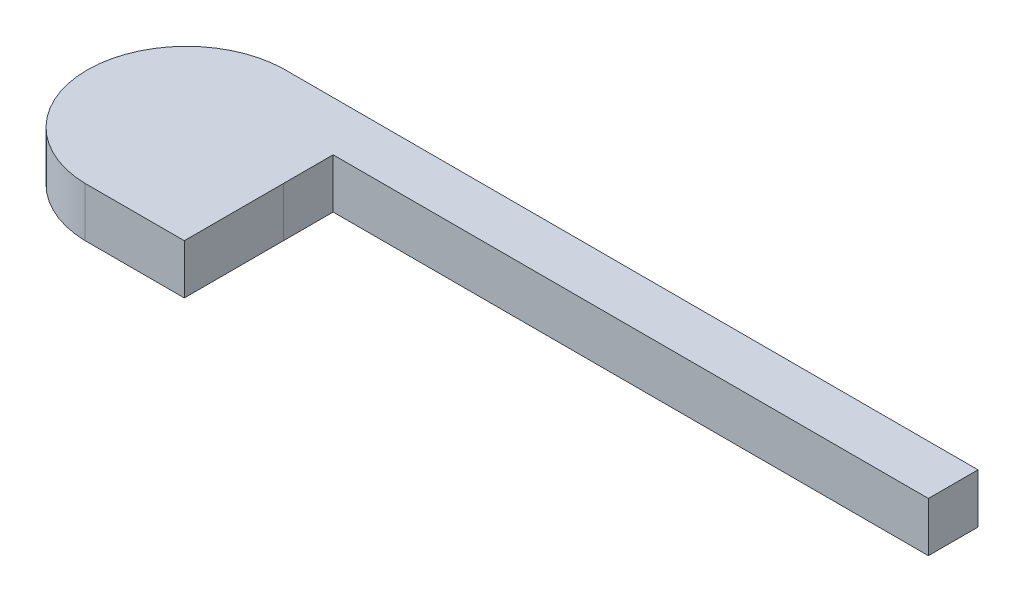
ISO-10303-21;
HEADER;
FILE_DESCRIPTION(('STEP AP214'),'2;1');
FILE_NAME('part.step','',(''),(''),'','','');
FILE_SCHEMA(('AUTOMOTIVE_DESIGN { 1 0 10303 214 1 1 1 1 }'));
ENDSEC;
DATA;
#1=APPLICATION_CONTEXT('core data for automotive mechanical design processes');
#2=APPLICATION_PROTOCOL_DEFINITION('international standard','automotive_design',2000,#1);
#3=PRODUCT_CONTEXT('',#1,'mechanical');
#4=PRODUCT('Part','Part','',(#3));
#5=PRODUCT_RELATED_PRODUCT_CATEGORY('part','',(#4));
#6=PRODUCT_DEFINITION_FORMATION('','',#4);
#7=PRODUCT_DEFINITION_CONTEXT('part definition',#1,'design');
#8=PRODUCT_DEFINITION('design','',#6,#7);
#9=PRODUCT_DEFINITION_SHAPE('','',#8);
#10=(LENGTH_UNIT() NAMED_UNIT(*) SI_UNIT(.MILLI.,.METRE.));
#11=(NAMED_UNIT(*) PLANE_ANGLE_UNIT() SI_UNIT($,.RADIAN.));
#12=(NAMED_UNIT(*) SI_UNIT($,.STERADIAN.) SOLID_ANGLE_UNIT());
#13=UNCERTAINTY_MEASURE_WITH_UNIT(LENGTH_MEASURE(1.E-05),#10,'distance_accuracy_value','');
#14=(GEOMETRIC_REPRESENTATION_CONTEXT(3) GLOBAL_UNCERTAINTY_ASSIGNED_CONTEXT((#13)) GLOBAL_UNIT_ASSIGNED_CONTEXT((#10,
#11,#12)) REPRESENTATION_CONTEXT('',''));
#15=CARTESIAN_POINT('',(0.,0.,0.));
#16=DIRECTION('',(0.,0.,1.));
#17=DIRECTION('',(1.,0.,0.));
#18=AXIS2_PLACEMENT_3D('',#15,#16,#17);
#19=CARTESIAN_POINT('',(-50.8,6.35,-12.7));
#20=DIRECTION('',(0.,0.,1.));
#21=DIRECTION('',(1.,0.,0.));
#22=AXIS2_PLACEMENT_3D('',#19,#20,#21);
#23=PLANE('',#22);
#24=DIRECTION('',(0.,-1.,0.));
#25=VECTOR('',#24,1.);
#26=CARTESIAN_POINT('',(-38.1000000000014,137.49902365725,-12.7));
#27=LINE('',#26,#25);
#28=CARTESIAN_POINT('',(-38.1000000000014,6.34999999999999,-12.7));
#29=VERTEX_POINT('',#28);
#30=CARTESIAN_POINT('',(-38.1000000000014,0.,-12.7));
#31=VERTEX_POINT('',#30);
#32=EDGE_CURVE('E61',#29,#31,#27,.T.);
#33=ORIENTED_EDGE('',*,*,#32,.F.);
#34=DIRECTION('',(-1.,0.,0.));
#35=VECTOR('',#34,1.);
#36=CARTESIAN_POINT('',(-50.8,6.35,-12.7));
#37=LINE('',#36,#35);
#38=CARTESIAN_POINT('',(50.8000000000001,6.35,-12.7));
#39=VERTEX_POINT('',#38);
#40=EDGE_CURVE('E153',#39,#29,#37,.T.);
#41=ORIENTED_EDGE('',*,*,#40,.F.);
#42=DIRECTION('',(0.,-1.,0.));
#43=VECTOR('',#42,1.);
#44=CARTESIAN_POINT('',(50.8000000000001,6.35,-12.7));
#45=LINE('',#44,#43);
#46=CARTESIAN_POINT('',(50.8000000000001,0.,-12.7));
#47=VERTEX_POINT('',#46);
#48=EDGE_CURVE('E11',#39,#47,#45,.T.);
#49=ORIENTED_EDGE('',*,*,#48,.T.);
#50=DIRECTION('',(-1.,0.,0.));
#51=VECTOR('',#50,1.);
#52=CARTESIAN_POINT('',(-50.8,0.,-12.7));
#53=LINE('',#52,#51);
#54=EDGE_CURVE('E96',#47,#31,#53,.T.);
#55=ORIENTED_EDGE('',*,*,#54,.T.);
#56=EDGE_LOOP('',(#33,#41,#49,#55));
#57=FACE_BOUND('',#56,.T.);
#58=ADVANCED_FACE('F38',(#57),#23,.F.);
#59=CARTESIAN_POINT('',(-50.8,6.35,12.7));
#60=DIRECTION('',(0.,0.,-1.));
#61=DIRECTION('',(-1.,0.,0.));
#62=AXIS2_PLACEMENT_3D('',#59,#60,#61);
#63=PLANE('',#62);
#64=DIRECTION('',(1.,0.,0.));
#65=VECTOR('',#64,1.);
#66=CARTESIAN_POINT('',(-50.8,6.35,12.7));
#67=LINE('',#66,#65);
#68=CARTESIAN_POINT('',(-38.1,6.34999999999999,12.7));
#69=VERTEX_POINT('',#68);
#70=CARTESIAN_POINT('',(-25.4,6.34999999999999,12.7));
#71=VERTEX_POINT('',#70);
#72=EDGE_CURVE('E46',#69,#71,#67,.T.);
#73=ORIENTED_EDGE('',*,*,#72,.F.);
#74=DIRECTION('',(0.,-1.,0.));
#75=VECTOR('',#74,1.);
#76=CARTESIAN_POINT('',(-38.1,137.49902365725,12.7));
#77=LINE('',#76,#75);
#78=CARTESIAN_POINT('',(-38.1,0.,12.7));
#79=VERTEX_POINT('',#78);
#80=EDGE_CURVE('E113',#69,#79,#77,.T.);
#81=ORIENTED_EDGE('',*,*,#80,.T.);
#82=DIRECTION('',(1.,0.,0.));
#83=VECTOR('',#82,1.);
#84=CARTESIAN_POINT('',(-50.8,0.,12.7));
#85=LINE('',#84,#83);
#86=CARTESIAN_POINT('',(-25.4,0.,12.7));
#87=VERTEX_POINT('',#86);
#88=EDGE_CURVE('E101',#79,#87,#85,.T.);
#89=ORIENTED_EDGE('',*,*,#88,.T.);
#90=DIRECTION('',(0.,-1.,0.));
#91=VECTOR('',#90,1.);
#92=CARTESIAN_POINT('',(-25.4,145.43652365725,12.7));
#93=LINE('',#92,#91);
#94=EDGE_CURVE('E133',#71,#87,#93,.T.);
#95=ORIENTED_EDGE('',*,*,#94,.F.);
#96=EDGE_LOOP('',(#73,#81,#89,#95));
#97=FACE_BOUND('',#96,.T.);
#98=ADVANCED_FACE('F158',(#97),#63,.F.);
#99=CARTESIAN_POINT('',(0.,6.35,0.));
#100=DIRECTION('',(0.,1.,0.));
#101=DIRECTION('',(0.,0.,1.));
#102=AXIS2_PLACEMENT_3D('',#99,#100,#101);
#103=PLANE('',#102);
#104=CARTESIAN_POINT('',(-37.843404017437,6.34999999999999,0.));
#105=DIRECTION('',(0.,1.,0.));
#106=DIRECTION('',(0.,0.,1.));
#107=AXIS2_PLACEMENT_3D('',#104,#105,#106);
#108=CIRCLE('',#107,12.702591920481);
#109=EDGE_CURVE('E53',#69,#29,#108,.F.);
#110=ORIENTED_EDGE('',*,*,#109,.F.);
#111=ORIENTED_EDGE('',*,*,#72,.T.);
#112=DIRECTION('',(0.,0.,-1.));
#113=VECTOR('',#112,1.);
#114=CARTESIAN_POINT('',(-25.4,6.34999999999999,0.));
#115=LINE('',#114,#113);
#116=CARTESIAN_POINT('',(-25.4,6.34999999999999,0.));
#117=VERTEX_POINT('',#116);
#118=EDGE_CURVE('E122',#71,#117,#115,.T.);
#119=ORIENTED_EDGE('',*,*,#118,.T.);
#120=DIRECTION('',(0.,0.,-1.));
#121=VECTOR('',#120,1.);
#122=CARTESIAN_POINT('',(-25.4,6.34999999999999,0.));
#123=LINE('',#122,#121);
#124=CARTESIAN_POINT('',(-25.4,6.34999999999999,-6.35));
#125=VERTEX_POINT('',#124);
#126=EDGE_CURVE('E119',#117,#125,#123,.T.);
#127=ORIENTED_EDGE('',*,*,#126,.T.);
#128=DIRECTION('',(1.,0.,0.));
#129=VECTOR('',#128,1.);
#130=CARTESIAN_POINT('',(-25.4,6.34999999999999,-6.35));
#131=LINE('',#130,#129);
#132=CARTESIAN_POINT('',(50.8000000000001,6.34999999999999,-6.35));
#133=VERTEX_POINT('',#132);
#134=EDGE_CURVE('E123',#125,#133,#131,.T.);
#135=ORIENTED_EDGE('',*,*,#134,.T.);
#136=DIRECTION('',(0.,0.,-1.));
#137=VECTOR('',#136,1.);
#138=CARTESIAN_POINT('',(50.8000000000001,6.35,-12.7));
#139=LINE('',#138,#137);
#140=EDGE_CURVE('E151',#133,#39,#139,.T.);
#141=ORIENTED_EDGE('',*,*,#140,.T.);
#142=ORIENTED_EDGE('',*,*,#40,.T.);
#143=EDGE_LOOP('',(#110,#111,#119,#127,#135,#141,#142));
#144=FACE_BOUND('',#143,.T.);
#145=ADVANCED_FACE('F171',(#144),#103,.T.);
#146=CARTESIAN_POINT('',(0.,0.,0.));
#147=DIRECTION('',(0.,1.,0.));
#148=DIRECTION('',(0.,0.,1.));
#149=AXIS2_PLACEMENT_3D('',#146,#147,#148);
#150=PLANE('',#149);
#151=CARTESIAN_POINT('',(-38.1,0.,0.));
#152=DIRECTION('',(0.,-1.,0.));
#153=DIRECTION('',(0.,0.,-1.));
#154=AXIS2_PLACEMENT_3D('',#151,#152,#153);
#155=CIRCLE('',#154,6.35);
#156=CARTESIAN_POINT('',(-38.1,0.,-6.35));
#157=VERTEX_POINT('',#156);
#158=EDGE_CURVE('E126',#157,#157,#155,.T.);
#159=ORIENTED_EDGE('',*,*,#158,.F.);
#160=EDGE_LOOP('',(#159));
#161=FACE_BOUND('',#160,.T.);
#162=ORIENTED_EDGE('',*,*,#88,.F.);
#163=CARTESIAN_POINT('',(-37.843404017437,0.,0.));
#164=DIRECTION('',(0.,1.,0.));
#165=DIRECTION('',(0.,0.,1.));
#166=AXIS2_PLACEMENT_3D('',#163,#164,#165);
#167=CIRCLE('',#166,12.702591920481);
#168=EDGE_CURVE('E106',#79,#31,#167,.F.);
#169=ORIENTED_EDGE('',*,*,#168,.T.);
#170=ORIENTED_EDGE('',*,*,#54,.F.);
#171=DIRECTION('',(0.,0.,-1.));
#172=VECTOR('',#171,1.);
#173=CARTESIAN_POINT('',(50.8000000000001,0.,-12.7));
#174=LINE('',#173,#172);
#175=CARTESIAN_POINT('',(50.8000000000001,0.,-6.35));
#176=VERTEX_POINT('',#175);
#177=EDGE_CURVE('E102',#176,#47,#174,.T.);
#178=ORIENTED_EDGE('',*,*,#177,.F.);
#179=DIRECTION('',(1.,0.,0.));
#180=VECTOR('',#179,1.);
#181=CARTESIAN_POINT('',(-25.4,0.,-6.35));
#182=LINE('',#181,#180);
#183=CARTESIAN_POINT('',(-25.4,0.,-6.35));
#184=VERTEX_POINT('',#183);
#185=EDGE_CURVE('E131',#184,#176,#182,.T.);
#186=ORIENTED_EDGE('',*,*,#185,.F.);
#187=DIRECTION('',(0.,0.,-1.));
#188=VECTOR('',#187,1.);
#189=CARTESIAN_POINT('',(-25.4,0.,0.));
#190=LINE('',#189,#188);
#191=CARTESIAN_POINT('',(-25.4,0.,0.));
#192=VERTEX_POINT('',#191);
#193=EDGE_CURVE('E129',#192,#184,#190,.T.);
#194=ORIENTED_EDGE('',*,*,#193,.F.);
#195=DIRECTION('',(0.,0.,-1.));
#196=VECTOR('',#195,1.);
#197=CARTESIAN_POINT('',(-25.4,0.,0.));
#198=LINE('',#197,#196);
#199=EDGE_CURVE('E118',#87,#192,#198,.T.);
#200=ORIENTED_EDGE('',*,*,#199,.F.);
#201=EDGE_LOOP('',(#162,#169,#170,#178,#186,#194,#200));
#202=FACE_BOUND('',#201,.T.);
#203=ADVANCED_FACE('F107',(#161,#202),#150,.F.);
#204=CARTESIAN_POINT('',(50.8000000000001,6.35,-12.7));
#205=DIRECTION('',(-1.,0.,0.));
#206=DIRECTION('',(0.,0.,1.));
#207=AXIS2_PLACEMENT_3D('',#204,#205,#206);
#208=PLANE('',#207);
#209=ORIENTED_EDGE('',*,*,#140,.F.);
#210=DIRECTION('',(0.,-1.,0.));
#211=VECTOR('',#210,1.);
#212=CARTESIAN_POINT('',(50.8000000000001,145.43652365725,-6.35));
#213=LINE('',#212,#211);
#214=EDGE_CURVE('E138',#133,#176,#213,.T.);
#215=ORIENTED_EDGE('',*,*,#214,.T.);
#216=ORIENTED_EDGE('',*,*,#177,.T.);
#217=ORIENTED_EDGE('',*,*,#48,.F.);
#218=EDGE_LOOP('',(#209,#215,#216,#217));
#219=FACE_BOUND('',#218,.T.);
#220=ADVANCED_FACE('F40',(#219),#208,.F.);
#221=CARTESIAN_POINT('',(-38.1,3.81,0.));
#222=DIRECTION('',(0.,-1.,0.));
#223=DIRECTION('',(0.,0.,-1.));
#224=AXIS2_PLACEMENT_3D('',#221,#222,#223);
#225=CYLINDRICAL_SURFACE('',#224,6.35);
#226=CARTESIAN_POINT('',(-38.1,3.81,0.));
#227=DIRECTION('',(0.,-1.,0.));
#228=DIRECTION('',(0.,0.,-1.));
#229=AXIS2_PLACEMENT_3D('',#226,#227,#228);
#230=CIRCLE('',#229,6.35);
#231=CARTESIAN_POINT('',(-38.1,3.81,-6.35));
#232=VERTEX_POINT('',#231);
#233=EDGE_CURVE('E146',#232,#232,#230,.T.);
#234=CARTESIAN_POINT('',(-38.1,3.81,-6.35));
#235=CARTESIAN_POINT('',(-38.1,3.7703125,-6.35));
#236=CARTESIAN_POINT('',(-38.1,3.730625,-6.35));
#237=CARTESIAN_POINT('',(-38.1,3.65125,-6.35));
#238=CARTESIAN_POINT('',(-38.1,3.6115625,-6.35));
#239=CARTESIAN_POINT('',(-38.1,3.5321875,-6.35));
#240=CARTESIAN_POINT('',(-38.1,3.4925,-6.35));
#241=CARTESIAN_POINT('',(-38.1,3.413125,-6.35));
#242=CARTESIAN_POINT('',(-38.1,3.3734375,-6.35));
#243=CARTESIAN_POINT('',(-38.1,3.2940625,-6.35));
#244=CARTESIAN_POINT('',(-38.1,3.254375,-6.35));
#245=CARTESIAN_POINT('',(-38.1,3.175,-6.35));
#246=CARTESIAN_POINT('',(-38.1,3.1353125,-6.35));
#247=CARTESIAN_POINT('',(-38.1,3.0559375,-6.35));
#248=CARTESIAN_POINT('',(-38.1,3.01625,-6.35));
#249=CARTESIAN_POINT('',(-38.1,2.936875,-6.35));
#250=CARTESIAN_POINT('',(-38.1,2.8971875,-6.35));
#251=CARTESIAN_POINT('',(-38.1,2.8178125,-6.35));
#252=CARTESIAN_POINT('',(-38.1,2.778125,-6.35));
#253=CARTESIAN_POINT('',(-38.1,2.69875,-6.35));
#254=CARTESIAN_POINT('',(-38.1,2.6590625,-6.35));
#255=CARTESIAN_POINT('',(-38.1,2.5796875,-6.35));
#256=CARTESIAN_POINT('',(-38.1,2.54,-6.35));
#257=CARTESIAN_POINT('',(-38.1,2.460625,-6.35));
#258=CARTESIAN_POINT('',(-38.1,2.4209375,-6.35));
#259=CARTESIAN_POINT('',(-38.1,2.3415625,-6.35));
#260=CARTESIAN_POINT('',(-38.1,2.301875,-6.35));
#261=CARTESIAN_POINT('',(-38.1,2.2225,-6.35));
#262=CARTESIAN_POINT('',(-38.1,2.1828125,-6.35));
#263=CARTESIAN_POINT('',(-38.1,2.1034375,-6.35));
#264=CARTESIAN_POINT('',(-38.1,2.06375,-6.35));
#265=CARTESIAN_POINT('',(-38.1,1.984375,-6.35));
#266=CARTESIAN_POINT('',(-38.1,1.9446875,-6.35));
#267=CARTESIAN_POINT('',(-38.1,1.8653125,-6.35));
#268=CARTESIAN_POINT('',(-38.1,1.825625,-6.35));
#269=CARTESIAN_POINT('',(-38.1,1.74625,-6.35));
#270=CARTESIAN_POINT('',(-38.1,1.7065625,-6.35));
#271=CARTESIAN_POINT('',(-38.1,1.6271875,-6.35));
#272=CARTESIAN_POINT('',(-38.1,1.5875,-6.35));
#273=CARTESIAN_POINT('',(-38.1,1.508125,-6.35));
#274=CARTESIAN_POINT('',(-38.1,1.4684375,-6.35));
#275=CARTESIAN_POINT('',(-38.1,1.3890625,-6.35));
#276=CARTESIAN_POINT('',(-38.1,1.349375,-6.35));
#277=CARTESIAN_POINT('',(-38.1,1.27,-6.35));
#278=CARTESIAN_POINT('',(-38.1,1.2303125,-6.35));
#279=CARTESIAN_POINT('',(-38.1,1.1509375,-6.35));
#280=CARTESIAN_POINT('',(-38.1,1.11125,-6.35));
#281=CARTESIAN_POINT('',(-38.1,1.031875,-6.35));
#282=CARTESIAN_POINT('',(-38.1,0.9921875,-6.35));
#283=CARTESIAN_POINT('',(-38.1,0.9128125,-6.35));
#284=CARTESIAN_POINT('',(-38.1,0.873125,-6.35));
#285=CARTESIAN_POINT('',(-38.1,0.79375,-6.35));
#286=CARTESIAN_POINT('',(-38.1,0.7540625,-6.35));
#287=CARTESIAN_POINT('',(-38.1,0.6746875,-6.35));
#288=CARTESIAN_POINT('',(-38.1,0.635,-6.35));
#289=CARTESIAN_POINT('',(-38.1,0.555625,-6.35));
#290=CARTESIAN_POINT('',(-38.1,0.5159375,-6.35));
#291=CARTESIAN_POINT('',(-38.1,0.4365625,-6.35));
#292=CARTESIAN_POINT('',(-38.1,0.396875,-6.35));
#293=CARTESIAN_POINT('',(-38.1,0.3175,-6.35));
#294=CARTESIAN_POINT('',(-38.1,0.2778125,-6.35));
#295=CARTESIAN_POINT('',(-38.1,0.1984375,-6.35));
#296=CARTESIAN_POINT('',(-38.1,0.15875,-6.35));
#297=CARTESIAN_POINT('',(-38.1,0.0793749999999999,-6.35));
#298=CARTESIAN_POINT('',(-38.1,0.0396874999999999,-6.35));
#299=CARTESIAN_POINT('',(-38.1,0.,-6.35));
#300=B_SPLINE_CURVE_WITH_KNOTS('',3,(#234,#235,#236,#237,#238,#239,#240,#241,#242,#243,#244,
#245,#246,#247,#248,#249,#250,#251,#252,#253,#254,#255,#256,#257,#258,#259,#260,#261,#262,#263,
#264,#265,#266,#267,#268,#269,#270,#271,#272,#273,#274,#275,#276,#277,#278,#279,#280,#281,#282,
#283,#284,#285,#286,#287,#288,#289,#290,#291,#292,#293,#294,#295,#296,#297,#298,#299),
.UNSPECIFIED.,.F.,.F.,(4,2,2,2,2,2,2,2,2,2,2,2,2,2,2,2,2,2,2,2,2,2,2,2,2,2,2,2,2,2,2,2,4),(0.,
0.1190625,0.238125,0.3571875,0.47625,0.5953125,0.714375,0.8334375,0.9525,1.0715625,1.190625,
1.3096875,1.42875,1.5478125,1.666875,1.7859375,1.905,2.0240625,2.143125,2.2621875,2.38125,
2.5003125,2.619375,2.7384375,2.8575,2.9765625,3.095625,3.2146875,3.33375,3.4528125,3.571875,
3.6909375,3.81),.UNSPECIFIED.);
#301=EDGE_CURVE('BSEAM174',#232,#157,#300,.T.);
#302=ORIENTED_EDGE('',*,*,#233,.F.);
#303=ORIENTED_EDGE('',*,*,#158,.T.);
#304=ORIENTED_EDGE('',*,*,#301,.T.);
#305=ORIENTED_EDGE('',*,*,#301,.F.);
#306=EDGE_LOOP('',(#302,#304,#303,#305));
#307=FACE_BOUND('',#306,.T.);
#308=ADVANCED_FACE('F174',(#307),#225,.F.);
#309=CARTESIAN_POINT('',(-38.1,3.81,0.));
#310=DIRECTION('',(0.,-1.,0.));
#311=DIRECTION('',(0.,0.,-1.));
#312=AXIS2_PLACEMENT_3D('',#309,#310,#311);
#313=PLANE('',#312);
#314=ORIENTED_EDGE('',*,*,#233,.T.);
#315=EDGE_LOOP('',(#314));
#316=FACE_BOUND('',#315,.T.);
#317=ADVANCED_FACE('F179',(#316),#313,.T.);
#318=CARTESIAN_POINT('',(-25.4,145.43652365725,-6.35));
#319=DIRECTION('',(0.,0.,-1.));
#320=DIRECTION('',(-1.,0.,0.));
#321=AXIS2_PLACEMENT_3D('',#318,#319,#320);
#322=PLANE('',#321);
#323=DIRECTION('',(0.,-1.,0.));
#324=VECTOR('',#323,1.);
#325=CARTESIAN_POINT('',(-25.4,145.43652365725,-6.35));
#326=LINE('',#325,#324);
#327=EDGE_CURVE('E141',#125,#184,#326,.T.);
#328=ORIENTED_EDGE('',*,*,#327,.T.);
#329=ORIENTED_EDGE('',*,*,#185,.T.);
#330=ORIENTED_EDGE('',*,*,#214,.F.);
#331=ORIENTED_EDGE('',*,*,#134,.F.);
#332=EDGE_LOOP('',(#328,#329,#330,#331));
#333=FACE_BOUND('',#332,.T.);
#334=ADVANCED_FACE('F169',(#333),#322,.F.);
#335=CARTESIAN_POINT('',(-25.4,145.43652365725,0.));
#336=DIRECTION('',(-1.,0.,0.));
#337=DIRECTION('',(0.,0.,1.));
#338=AXIS2_PLACEMENT_3D('',#335,#336,#337);
#339=PLANE('',#338);
#340=DIRECTION('',(0.,-1.,0.));
#341=VECTOR('',#340,1.);
#342=CARTESIAN_POINT('',(-25.4,145.43652365725,0.));
#343=LINE('',#342,#341);
#344=EDGE_CURVE('E136',#117,#192,#343,.T.);
#345=ORIENTED_EDGE('',*,*,#344,.T.);
#346=ORIENTED_EDGE('',*,*,#193,.T.);
#347=ORIENTED_EDGE('',*,*,#327,.F.);
#348=ORIENTED_EDGE('',*,*,#126,.F.);
#349=EDGE_LOOP('',(#345,#346,#347,#348));
#350=FACE_BOUND('',#349,.T.);
#351=ADVANCED_FACE('F167',(#350),#339,.F.);
#352=CARTESIAN_POINT('',(-25.4,145.43652365725,0.));
#353=DIRECTION('',(-1.,0.,0.));
#354=DIRECTION('',(0.,0.,1.));
#355=AXIS2_PLACEMENT_3D('',#352,#353,#354);
#356=PLANE('',#355);
#357=ORIENTED_EDGE('',*,*,#94,.T.);
#358=ORIENTED_EDGE('',*,*,#199,.T.);
#359=ORIENTED_EDGE('',*,*,#344,.F.);
#360=ORIENTED_EDGE('',*,*,#118,.F.);
#361=EDGE_LOOP('',(#357,#358,#359,#360));
#362=FACE_BOUND('',#361,.T.);
#363=ADVANCED_FACE('F161',(#362),#356,.F.);
#364=CARTESIAN_POINT('',(-37.843404017437,137.49902365725,0.));
#365=DIRECTION('',(0.,-1.,0.));
#366=DIRECTION('',(0.,0.,-1.));
#367=AXIS2_PLACEMENT_3D('',#364,#365,#366);
#368=CYLINDRICAL_SURFACE('',#367,12.702591920481);
#369=ORIENTED_EDGE('',*,*,#80,.F.);
#370=ORIENTED_EDGE('',*,*,#109,.T.);
#371=ORIENTED_EDGE('',*,*,#32,.T.);
#372=ORIENTED_EDGE('',*,*,#168,.F.);
#373=EDGE_LOOP('',(#369,#370,#371,#372));
#374=FACE_BOUND('',#373,.T.);
#375=ADVANCED_FACE('F112',(#374),#368,.T.);
#376=CLOSED_SHELL('',(#58,#98,#145,#203,#220,#308,#317,#334,#351,#363,#375));
#377=MANIFOLD_SOLID_BREP('B2',#376);
#378=ADVANCED_BREP_SHAPE_REPRESENTATION('',(#18,#377),#14);
#379=SHAPE_DEFINITION_REPRESENTATION(#9,#378);
ENDSEC;
END-ISO-10303-21;
